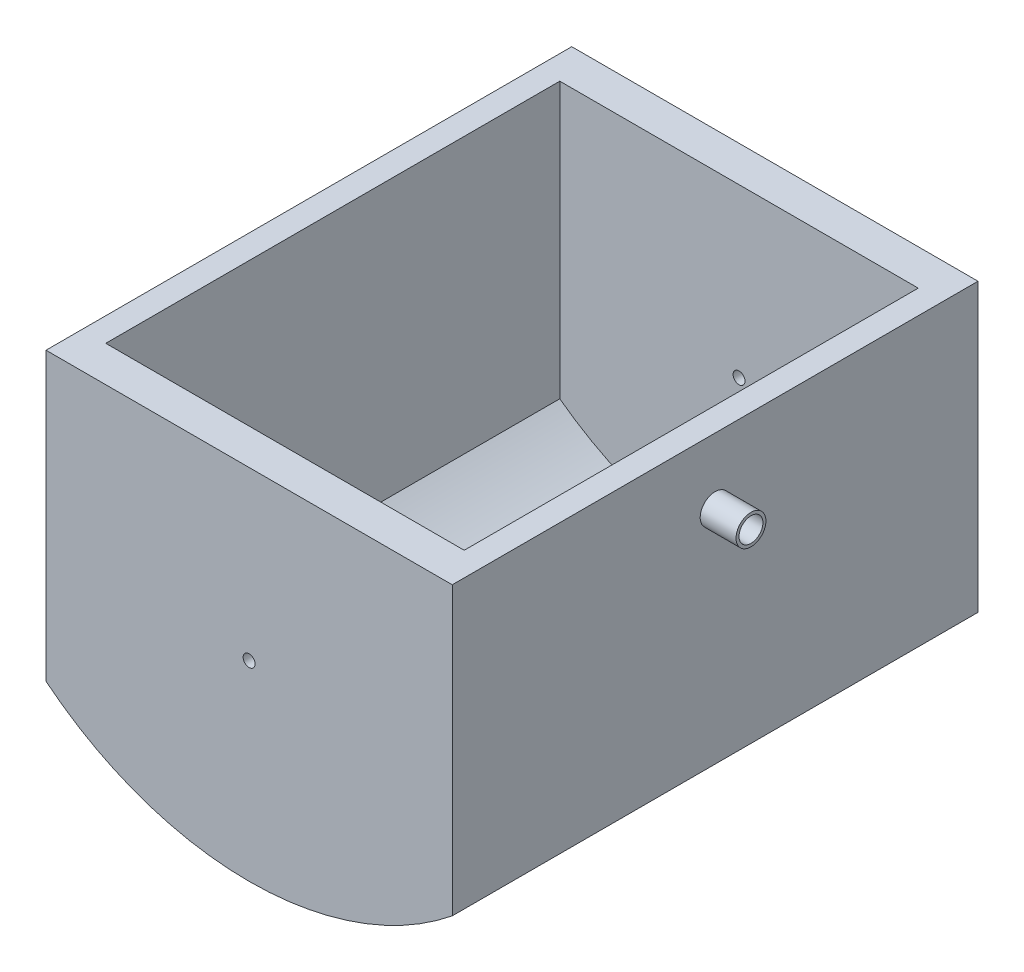
ISO-10303-21;
HEADER;
FILE_DESCRIPTION(('STEP AP214'),'2;1');
FILE_NAME('part.step','',(''),(''),'','','');
FILE_SCHEMA(('AUTOMOTIVE_DESIGN { 1 0 10303 214 1 1 1 1 }'));
ENDSEC;
DATA;
#1=APPLICATION_CONTEXT('core data for automotive mechanical design processes');
#2=APPLICATION_PROTOCOL_DEFINITION('international standard','automotive_design',2000,#1);
#3=PRODUCT_CONTEXT('',#1,'mechanical');
#4=PRODUCT('Part','Part','',(#3));
#5=PRODUCT_RELATED_PRODUCT_CATEGORY('part','',(#4));
#6=PRODUCT_DEFINITION_FORMATION('','',#4);
#7=PRODUCT_DEFINITION_CONTEXT('part definition',#1,'design');
#8=PRODUCT_DEFINITION('design','',#6,#7);
#9=PRODUCT_DEFINITION_SHAPE('','',#8);
#10=(LENGTH_UNIT() NAMED_UNIT(*) SI_UNIT(.MILLI.,.METRE.));
#11=(NAMED_UNIT(*) PLANE_ANGLE_UNIT() SI_UNIT($,.RADIAN.));
#12=(NAMED_UNIT(*) SI_UNIT($,.STERADIAN.) SOLID_ANGLE_UNIT());
#13=UNCERTAINTY_MEASURE_WITH_UNIT(LENGTH_MEASURE(1.E-05),#10,'distance_accuracy_value','');
#14=(GEOMETRIC_REPRESENTATION_CONTEXT(3) GLOBAL_UNCERTAINTY_ASSIGNED_CONTEXT((#13)) GLOBAL_UNIT_ASSIGNED_CONTEXT((#10,
#11,#12)) REPRESENTATION_CONTEXT('',''));
#15=CARTESIAN_POINT('',(0.,0.,0.));
#16=DIRECTION('',(0.,0.,1.));
#17=DIRECTION('',(1.,0.,0.));
#18=AXIS2_PLACEMENT_3D('',#15,#16,#17);
#19=CARTESIAN_POINT('',(170.,140.,220.));
#20=DIRECTION('',(-1.,0.,0.));
#21=DIRECTION('',(0.,-1.,0.));
#22=AXIS2_PLACEMENT_3D('',#19,#20,#21);
#23=PLANE('',#22);
#24=DIRECTION('',(0.,1.,0.));
#25=VECTOR('',#24,1.);
#26=CARTESIAN_POINT('',(170.,140.,-220.));
#27=LINE('',#26,#25);
#28=CARTESIAN_POINT('',(170.,-100.,-220.));
#29=VERTEX_POINT('',#28);
#30=CARTESIAN_POINT('',(170.,140.,-220.));
#31=VERTEX_POINT('',#30);
#32=EDGE_CURVE('E257',#29,#31,#27,.T.);
#33=ORIENTED_EDGE('',*,*,#32,.T.);
#34=DIRECTION('',(0.,0.,-1.));
#35=VECTOR('',#34,1.);
#36=CARTESIAN_POINT('',(170.,140.,220.));
#37=LINE('',#36,#35);
#38=CARTESIAN_POINT('',(170.,140.,220.));
#39=VERTEX_POINT('',#38);
#40=EDGE_CURVE('E265',#39,#31,#37,.T.);
#41=ORIENTED_EDGE('',*,*,#40,.F.);
#42=DIRECTION('',(0.,1.,0.));
#43=VECTOR('',#42,1.);
#44=CARTESIAN_POINT('',(170.,140.,220.));
#45=LINE('',#44,#43);
#46=CARTESIAN_POINT('',(170.,-100.,220.));
#47=VERTEX_POINT('',#46);
#48=EDGE_CURVE('E244',#47,#39,#45,.T.);
#49=ORIENTED_EDGE('',*,*,#48,.F.);
#50=DIRECTION('',(0.,0.,-1.));
#51=VECTOR('',#50,1.);
#52=CARTESIAN_POINT('',(170.,-100.,220.));
#53=LINE('',#52,#51);
#54=EDGE_CURVE('E269',#47,#29,#53,.T.);
#55=ORIENTED_EDGE('',*,*,#54,.T.);
#56=EDGE_LOOP('',(#33,#41,#49,#55));
#57=FACE_BOUND('',#56,.T.);
#58=CARTESIAN_POINT('',(170.,85.,0.));
#59=DIRECTION('',(-1.,0.,0.));
#60=DIRECTION('',(0.,-1.,0.));
#61=AXIS2_PLACEMENT_3D('',#58,#59,#60);
#62=CIRCLE('',#61,12.5);
#63=CARTESIAN_POINT('',(170.,72.5000000000001,0.));
#64=VERTEX_POINT('',#63);
#65=EDGE_CURVE('E11',#64,#64,#62,.F.);
#66=ORIENTED_EDGE('',*,*,#65,.F.);
#67=EDGE_LOOP('',(#66));
#68=FACE_BOUND('',#67,.T.);
#69=ADVANCED_FACE('F45',(#57,#68),#23,.F.);
#70=CARTESIAN_POINT('',(0.,110.833333333333,220.));
#71=DIRECTION('',(0.,0.,-1.));
#72=DIRECTION('',(-1.,0.,0.));
#73=AXIS2_PLACEMENT_3D('',#70,#71,#72);
#74=CYLINDRICAL_SURFACE('',#73,270.833333333333);
#75=CARTESIAN_POINT('',(0.,110.833333333333,-220.));
#76=DIRECTION('',(0.,0.,1.));
#77=DIRECTION('',(1.,0.,0.));
#78=AXIS2_PLACEMENT_3D('',#75,#76,#77);
#79=CIRCLE('',#78,270.833333333333);
#80=CARTESIAN_POINT('',(-170.,-100.,-220.));
#81=VERTEX_POINT('',#80);
#82=EDGE_CURVE('E254',#81,#29,#79,.T.);
#83=ORIENTED_EDGE('',*,*,#82,.T.);
#84=ORIENTED_EDGE('',*,*,#54,.F.);
#85=CARTESIAN_POINT('',(0.,110.833333333333,220.));
#86=DIRECTION('',(0.,0.,1.));
#87=DIRECTION('',(1.,0.,0.));
#88=AXIS2_PLACEMENT_3D('',#85,#86,#87);
#89=CIRCLE('',#88,270.833333333333);
#90=CARTESIAN_POINT('',(-170.,-100.,220.));
#91=VERTEX_POINT('',#90);
#92=EDGE_CURVE('E240',#91,#47,#89,.T.);
#93=ORIENTED_EDGE('',*,*,#92,.F.);
#94=DIRECTION('',(0.,0.,-1.));
#95=VECTOR('',#94,1.);
#96=CARTESIAN_POINT('',(-170.,-100.,220.));
#97=LINE('',#96,#95);
#98=EDGE_CURVE('E273',#91,#81,#97,.T.);
#99=ORIENTED_EDGE('',*,*,#98,.T.);
#100=EDGE_LOOP('',(#83,#84,#93,#99));
#101=FACE_BOUND('',#100,.T.);
#102=CARTESIAN_POINT('',(0.,110.833333333333,-190.));
#103=DIRECTION('',(0.,0.,1.));
#104=DIRECTION('',(1.,0.,0.));
#105=AXIS2_PLACEMENT_3D('',#102,#103,#104);
#106=CIRCLE('',#105,270.833333333333);
#107=CARTESIAN_POINT('',(-80.,-147.91498925919,-190.));
#108=VERTEX_POINT('',#107);
#109=CARTESIAN_POINT('',(80.,-147.91498925919,-190.));
#110=VERTEX_POINT('',#109);
#111=EDGE_CURVE('E224',#108,#110,#106,.T.);
#112=ORIENTED_EDGE('',*,*,#111,.F.);
#113=DIRECTION('',(0.,0.,-1.));
#114=VECTOR('',#113,1.);
#115=CARTESIAN_POINT('',(-80.,-147.91498925919,220.));
#116=LINE('',#115,#114);
#117=CARTESIAN_POINT('',(-80.,-147.91498925919,190.));
#118=VERTEX_POINT('',#117);
#119=EDGE_CURVE('E277',#108,#118,#116,.F.);
#120=ORIENTED_EDGE('',*,*,#119,.T.);
#121=CARTESIAN_POINT('',(0.,110.833333333333,190.));
#122=DIRECTION('',(0.,0.,1.));
#123=DIRECTION('',(1.,0.,0.));
#124=AXIS2_PLACEMENT_3D('',#121,#122,#123);
#125=CIRCLE('',#124,270.833333333333);
#126=CARTESIAN_POINT('',(80.,-147.91498925919,190.));
#127=VERTEX_POINT('',#126);
#128=EDGE_CURVE('E219',#118,#127,#125,.T.);
#129=ORIENTED_EDGE('',*,*,#128,.T.);
#130=DIRECTION('',(0.,0.,-1.));
#131=VECTOR('',#130,1.);
#132=CARTESIAN_POINT('',(80.,-147.91498925919,220.));
#133=LINE('',#132,#131);
#134=EDGE_CURVE('E54',#127,#110,#133,.T.);
#135=ORIENTED_EDGE('',*,*,#134,.T.);
#136=EDGE_LOOP('',(#112,#120,#129,#135));
#137=FACE_BOUND('',#136,.T.);
#138=ADVANCED_FACE('F317',(#101,#137),#74,.T.);
#139=CARTESIAN_POINT('',(-170.,140.,220.));
#140=DIRECTION('',(0.,-1.,0.));
#141=DIRECTION('',(0.,0.,-1.));
#142=AXIS2_PLACEMENT_3D('',#139,#140,#141);
#143=PLANE('',#142);
#144=DIRECTION('',(-1.,0.,0.));
#145=VECTOR('',#144,1.);
#146=CARTESIAN_POINT('',(-170.,140.,-220.));
#147=LINE('',#146,#145);
#148=CARTESIAN_POINT('',(-170.,140.,-220.));
#149=VERTEX_POINT('',#148);
#150=EDGE_CURVE('E241',#31,#149,#147,.T.);
#151=ORIENTED_EDGE('',*,*,#150,.T.);
#152=DIRECTION('',(0.,0.,-1.));
#153=VECTOR('',#152,1.);
#154=CARTESIAN_POINT('',(-170.,140.,220.));
#155=LINE('',#154,#153);
#156=CARTESIAN_POINT('',(-170.,140.,220.));
#157=VERTEX_POINT('',#156);
#158=EDGE_CURVE('E250',#157,#149,#155,.T.);
#159=ORIENTED_EDGE('',*,*,#158,.F.);
#160=DIRECTION('',(-1.,0.,0.));
#161=VECTOR('',#160,1.);
#162=CARTESIAN_POINT('',(-170.,140.,220.));
#163=LINE('',#162,#161);
#164=EDGE_CURVE('E247',#39,#157,#163,.T.);
#165=ORIENTED_EDGE('',*,*,#164,.F.);
#166=ORIENTED_EDGE('',*,*,#40,.T.);
#167=EDGE_LOOP('',(#151,#159,#165,#166));
#168=FACE_BOUND('',#167,.T.);
#169=DIRECTION('',(-1.,0.,0.));
#170=VECTOR('',#169,1.);
#171=CARTESIAN_POINT('',(-150.,140.,-190.));
#172=LINE('',#171,#170);
#173=CARTESIAN_POINT('',(150.,140.,-190.));
#174=VERTEX_POINT('',#173);
#175=CARTESIAN_POINT('',(-150.,140.,-190.));
#176=VERTEX_POINT('',#175);
#177=EDGE_CURVE('E144',#174,#176,#172,.T.);
#178=ORIENTED_EDGE('',*,*,#177,.F.);
#179=DIRECTION('',(0.,0.,1.));
#180=VECTOR('',#179,1.);
#181=CARTESIAN_POINT('',(150.,140.,-190.));
#182=LINE('',#181,#180);
#183=CARTESIAN_POINT('',(150.,140.,190.));
#184=VERTEX_POINT('',#183);
#185=EDGE_CURVE('E206',#174,#184,#182,.T.);
#186=ORIENTED_EDGE('',*,*,#185,.T.);
#187=DIRECTION('',(-1.,0.,0.));
#188=VECTOR('',#187,1.);
#189=CARTESIAN_POINT('',(-150.,140.,190.));
#190=LINE('',#189,#188);
#191=CARTESIAN_POINT('',(-150.,140.,190.));
#192=VERTEX_POINT('',#191);
#193=EDGE_CURVE('E160',#184,#192,#190,.T.);
#194=ORIENTED_EDGE('',*,*,#193,.T.);
#195=DIRECTION('',(0.,0.,1.));
#196=VECTOR('',#195,1.);
#197=CARTESIAN_POINT('',(-150.,140.,-190.));
#198=LINE('',#197,#196);
#199=EDGE_CURVE('E202',#176,#192,#198,.T.);
#200=ORIENTED_EDGE('',*,*,#199,.F.);
#201=EDGE_LOOP('',(#178,#186,#194,#200));
#202=FACE_BOUND('',#201,.T.);
#203=ADVANCED_FACE('F324',(#168,#202),#143,.F.);
#204=CARTESIAN_POINT('',(0.,0.,220.));
#205=DIRECTION('',(0.,0.,-1.));
#206=DIRECTION('',(-1.,0.,0.));
#207=AXIS2_PLACEMENT_3D('',#204,#205,#206);
#208=CYLINDRICAL_SURFACE('',#207,5.);
#209=CARTESIAN_POINT('',(0.,0.,-220.));
#210=DIRECTION('',(0.,0.,1.));
#211=DIRECTION('',(1.,0.,0.));
#212=AXIS2_PLACEMENT_3D('',#209,#210,#211);
#213=CIRCLE('',#212,5.);
#214=CARTESIAN_POINT('',(5.,0.,-220.));
#215=VERTEX_POINT('',#214);
#216=EDGE_CURVE('E227',#215,#215,#213,.T.);
#217=ORIENTED_EDGE('',*,*,#216,.F.);
#218=EDGE_LOOP('',(#217));
#219=FACE_BOUND('',#218,.T.);
#220=CARTESIAN_POINT('',(0.,0.,-190.));
#221=DIRECTION('',(0.,0.,1.));
#222=DIRECTION('',(1.,0.,0.));
#223=AXIS2_PLACEMENT_3D('',#220,#221,#222);
#224=CIRCLE('',#223,5.);
#225=CARTESIAN_POINT('',(5.,0.,-190.));
#226=VERTEX_POINT('',#225);
#227=EDGE_CURVE('E223',#226,#226,#224,.T.);
#228=ORIENTED_EDGE('',*,*,#227,.T.);
#229=EDGE_LOOP('',(#228));
#230=FACE_BOUND('',#229,.T.);
#231=ADVANCED_FACE('F330',(#219,#230),#208,.F.);
#232=CARTESIAN_POINT('',(0.,110.833333333333,220.));
#233=DIRECTION('',(0.,0.,1.));
#234=DIRECTION('',(1.,0.,0.));
#235=AXIS2_PLACEMENT_3D('',#232,#233,#234);
#236=PLANE('',#235);
#237=DIRECTION('',(0.,-1.,0.));
#238=VECTOR('',#237,1.);
#239=CARTESIAN_POINT('',(-170.,140.,220.));
#240=LINE('',#239,#238);
#241=EDGE_CURVE('E236',#157,#91,#240,.T.);
#242=ORIENTED_EDGE('',*,*,#241,.T.);
#243=ORIENTED_EDGE('',*,*,#92,.T.);
#244=ORIENTED_EDGE('',*,*,#48,.T.);
#245=ORIENTED_EDGE('',*,*,#164,.T.);
#246=EDGE_LOOP('',(#242,#243,#244,#245));
#247=FACE_BOUND('',#246,.T.);
#248=CARTESIAN_POINT('',(0.,0.,220.));
#249=DIRECTION('',(0.,0.,1.));
#250=DIRECTION('',(1.,0.,0.));
#251=AXIS2_PLACEMENT_3D('',#248,#249,#250);
#252=CIRCLE('',#251,5.);
#253=CARTESIAN_POINT('',(5.,0.,220.));
#254=VERTEX_POINT('',#253);
#255=EDGE_CURVE('E228',#254,#254,#252,.T.);
#256=ORIENTED_EDGE('',*,*,#255,.F.);
#257=EDGE_LOOP('',(#256));
#258=FACE_BOUND('',#257,.T.);
#259=ADVANCED_FACE('F335',(#247,#258),#236,.T.);
#260=CARTESIAN_POINT('',(0.,110.833333333333,-220.));
#261=DIRECTION('',(0.,0.,1.));
#262=DIRECTION('',(1.,0.,0.));
#263=AXIS2_PLACEMENT_3D('',#260,#261,#262);
#264=PLANE('',#263);
#265=DIRECTION('',(0.,-1.,0.));
#266=VECTOR('',#265,1.);
#267=CARTESIAN_POINT('',(-170.,140.,-220.));
#268=LINE('',#267,#266);
#269=EDGE_CURVE('E232',#149,#81,#268,.T.);
#270=ORIENTED_EDGE('',*,*,#269,.F.);
#271=ORIENTED_EDGE('',*,*,#150,.F.);
#272=ORIENTED_EDGE('',*,*,#32,.F.);
#273=ORIENTED_EDGE('',*,*,#82,.F.);
#274=EDGE_LOOP('',(#270,#271,#272,#273));
#275=FACE_BOUND('',#274,.T.);
#276=ORIENTED_EDGE('',*,*,#216,.T.);
#277=EDGE_LOOP('',(#276));
#278=FACE_BOUND('',#277,.T.);
#279=ADVANCED_FACE('F332',(#275,#278),#264,.F.);
#280=CARTESIAN_POINT('',(-170.,140.,220.));
#281=DIRECTION('',(1.,0.,0.));
#282=DIRECTION('',(0.,1.,0.));
#283=AXIS2_PLACEMENT_3D('',#280,#281,#282);
#284=PLANE('',#283);
#285=ORIENTED_EDGE('',*,*,#269,.T.);
#286=ORIENTED_EDGE('',*,*,#98,.F.);
#287=ORIENTED_EDGE('',*,*,#241,.F.);
#288=ORIENTED_EDGE('',*,*,#158,.T.);
#289=EDGE_LOOP('',(#285,#286,#287,#288));
#290=FACE_BOUND('',#289,.T.);
#291=ADVANCED_FACE('F47',(#290),#284,.F.);
#292=CARTESIAN_POINT('',(0.,0.,190.));
#293=DIRECTION('',(0.,0.,1.));
#294=DIRECTION('',(1.,0.,0.));
#295=AXIS2_PLACEMENT_3D('',#292,#293,#294);
#296=CIRCLE('',#295,5.);
#297=CARTESIAN_POINT('',(5.,0.,190.));
#298=VERTEX_POINT('',#297);
#299=EDGE_CURVE('E205',#298,#298,#296,.T.);
#300=ORIENTED_EDGE('',*,*,#299,.F.);
#301=EDGE_LOOP('',(#300));
#302=FACE_BOUND('',#301,.T.);
#303=ORIENTED_EDGE('',*,*,#255,.T.);
#304=EDGE_LOOP('',(#303));
#305=FACE_BOUND('',#304,.T.);
#306=ADVANCED_FACE('F340',(#302,#305),#208,.F.);
#307=CARTESIAN_POINT('',(80.,-126.900469713501,-190.));
#308=DIRECTION('',(1.,0.,0.));
#309=DIRECTION('',(0.,1.,0.));
#310=AXIS2_PLACEMENT_3D('',#307,#308,#309);
#311=PLANE('',#310);
#312=DIRECTION('',(0.,1.,0.));
#313=VECTOR('',#312,1.);
#314=CARTESIAN_POINT('',(80.,-126.900469713501,190.));
#315=LINE('',#314,#313);
#316=CARTESIAN_POINT('',(79.9999999999999,-126.900469713501,190.));
#317=VERTEX_POINT('',#316);
#318=EDGE_CURVE('E61',#127,#317,#315,.T.);
#319=ORIENTED_EDGE('',*,*,#318,.T.);
#320=DIRECTION('',(0.,0.,1.));
#321=VECTOR('',#320,1.);
#322=CARTESIAN_POINT('',(79.9999999999999,-126.900469713501,-190.));
#323=LINE('',#322,#321);
#324=CARTESIAN_POINT('',(79.9999999999999,-126.900469713501,-190.));
#325=VERTEX_POINT('',#324);
#326=EDGE_CURVE('E213',#325,#317,#323,.T.);
#327=ORIENTED_EDGE('',*,*,#326,.F.);
#328=DIRECTION('',(0.,1.,0.));
#329=VECTOR('',#328,1.);
#330=CARTESIAN_POINT('',(80.,-126.900469713501,-190.));
#331=LINE('',#330,#329);
#332=EDGE_CURVE('E172',#110,#325,#331,.T.);
#333=ORIENTED_EDGE('',*,*,#332,.F.);
#334=ORIENTED_EDGE('',*,*,#134,.F.);
#335=EDGE_LOOP('',(#319,#327,#333,#334));
#336=FACE_BOUND('',#335,.T.);
#337=ADVANCED_FACE('F343',(#336),#311,.F.);
#338=CARTESIAN_POINT('',(-80.,-126.900469713501,-190.));
#339=DIRECTION('',(-1.,0.,0.));
#340=DIRECTION('',(0.,-1.,0.));
#341=AXIS2_PLACEMENT_3D('',#338,#339,#340);
#342=PLANE('',#341);
#343=DIRECTION('',(0.,-1.,0.));
#344=VECTOR('',#343,1.);
#345=CARTESIAN_POINT('',(-80.,-126.900469713501,-190.));
#346=LINE('',#345,#344);
#347=CARTESIAN_POINT('',(-80.,-126.900469713501,-190.));
#348=VERTEX_POINT('',#347);
#349=EDGE_CURVE('E153',#348,#108,#346,.T.);
#350=ORIENTED_EDGE('',*,*,#349,.F.);
#351=DIRECTION('',(0.,0.,1.));
#352=VECTOR('',#351,1.);
#353=CARTESIAN_POINT('',(-80.,-126.900469713501,-190.));
#354=LINE('',#353,#352);
#355=CARTESIAN_POINT('',(-80.,-126.900469713501,190.));
#356=VERTEX_POINT('',#355);
#357=EDGE_CURVE('E143',#348,#356,#354,.T.);
#358=ORIENTED_EDGE('',*,*,#357,.T.);
#359=DIRECTION('',(0.,-1.,0.));
#360=VECTOR('',#359,1.);
#361=CARTESIAN_POINT('',(-80.,-126.900469713501,190.));
#362=LINE('',#361,#360);
#363=EDGE_CURVE('E190',#356,#118,#362,.T.);
#364=ORIENTED_EDGE('',*,*,#363,.T.);
#365=ORIENTED_EDGE('',*,*,#119,.F.);
#366=EDGE_LOOP('',(#350,#358,#364,#365));
#367=FACE_BOUND('',#366,.T.);
#368=ADVANCED_FACE('F352',(#367),#342,.F.);
#369=CARTESIAN_POINT('',(0.,110.833333333333,-190.));
#370=DIRECTION('',(0.,0.,1.));
#371=DIRECTION('',(1.,0.,0.));
#372=AXIS2_PLACEMENT_3D('',#369,#370,#371);
#373=PLANE('',#372);
#374=ORIENTED_EDGE('',*,*,#227,.F.);
#375=EDGE_LOOP('',(#374));
#376=FACE_BOUND('',#375,.T.);
#377=ORIENTED_EDGE('',*,*,#111,.T.);
#378=ORIENTED_EDGE('',*,*,#332,.T.);
#379=CARTESIAN_POINT('',(0.,110.833333333333,-190.));
#380=DIRECTION('',(0.,0.,1.));
#381=DIRECTION('',(1.,0.,0.));
#382=AXIS2_PLACEMENT_3D('',#379,#380,#381);
#383=CIRCLE('',#382,250.833333333333);
#384=CARTESIAN_POINT('',(150.,-90.2073618283953,-190.));
#385=VERTEX_POINT('',#384);
#386=EDGE_CURVE('E175',#325,#385,#383,.T.);
#387=ORIENTED_EDGE('',*,*,#386,.T.);
#388=DIRECTION('',(0.,1.,0.));
#389=VECTOR('',#388,1.);
#390=CARTESIAN_POINT('',(150.,140.,-190.));
#391=LINE('',#390,#389);
#392=EDGE_CURVE('E179',#385,#174,#391,.T.);
#393=ORIENTED_EDGE('',*,*,#392,.T.);
#394=ORIENTED_EDGE('',*,*,#177,.T.);
#395=DIRECTION('',(0.,-1.,0.));
#396=VECTOR('',#395,1.);
#397=CARTESIAN_POINT('',(-150.,140.,-190.));
#398=LINE('',#397,#396);
#399=CARTESIAN_POINT('',(-150.,-90.2073618283952,-190.));
#400=VERTEX_POINT('',#399);
#401=EDGE_CURVE('E138',#176,#400,#398,.T.);
#402=ORIENTED_EDGE('',*,*,#401,.T.);
#403=CARTESIAN_POINT('',(0.,110.833333333333,-190.));
#404=DIRECTION('',(0.,0.,1.));
#405=DIRECTION('',(1.,0.,0.));
#406=AXIS2_PLACEMENT_3D('',#403,#404,#405);
#407=CIRCLE('',#406,250.833333333333);
#408=EDGE_CURVE('E147',#400,#348,#407,.T.);
#409=ORIENTED_EDGE('',*,*,#408,.T.);
#410=ORIENTED_EDGE('',*,*,#349,.T.);
#411=EDGE_LOOP('',(#377,#378,#387,#393,#394,#402,#409,#410));
#412=FACE_BOUND('',#411,.T.);
#413=ADVANCED_FACE('F155',(#376,#412),#373,.T.);
#414=CARTESIAN_POINT('',(0.,110.833333333333,190.));
#415=DIRECTION('',(0.,0.,1.));
#416=DIRECTION('',(1.,0.,0.));
#417=AXIS2_PLACEMENT_3D('',#414,#415,#416);
#418=PLANE('',#417);
#419=ORIENTED_EDGE('',*,*,#299,.T.);
#420=EDGE_LOOP('',(#419));
#421=FACE_BOUND('',#420,.T.);
#422=ORIENTED_EDGE('',*,*,#363,.F.);
#423=CARTESIAN_POINT('',(0.,110.833333333333,190.));
#424=DIRECTION('',(0.,0.,1.));
#425=DIRECTION('',(1.,0.,0.));
#426=AXIS2_PLACEMENT_3D('',#423,#424,#425);
#427=CIRCLE('',#426,250.833333333333);
#428=CARTESIAN_POINT('',(-150.,-90.2073618283952,190.));
#429=VERTEX_POINT('',#428);
#430=EDGE_CURVE('E186',#429,#356,#427,.T.);
#431=ORIENTED_EDGE('',*,*,#430,.F.);
#432=DIRECTION('',(0.,-1.,0.));
#433=VECTOR('',#432,1.);
#434=CARTESIAN_POINT('',(-150.,140.,190.));
#435=LINE('',#434,#433);
#436=EDGE_CURVE('E68',#192,#429,#435,.T.);
#437=ORIENTED_EDGE('',*,*,#436,.F.);
#438=ORIENTED_EDGE('',*,*,#193,.F.);
#439=DIRECTION('',(0.,1.,0.));
#440=VECTOR('',#439,1.);
#441=CARTESIAN_POINT('',(150.,140.,190.));
#442=LINE('',#441,#440);
#443=CARTESIAN_POINT('',(150.,-90.2073618283953,190.));
#444=VERTEX_POINT('',#443);
#445=EDGE_CURVE('E164',#444,#184,#442,.T.);
#446=ORIENTED_EDGE('',*,*,#445,.F.);
#447=CARTESIAN_POINT('',(0.,110.833333333333,190.));
#448=DIRECTION('',(0.,0.,1.));
#449=DIRECTION('',(1.,0.,0.));
#450=AXIS2_PLACEMENT_3D('',#447,#448,#449);
#451=CIRCLE('',#450,250.833333333333);
#452=EDGE_CURVE('E196',#317,#444,#451,.T.);
#453=ORIENTED_EDGE('',*,*,#452,.F.);
#454=ORIENTED_EDGE('',*,*,#318,.F.);
#455=ORIENTED_EDGE('',*,*,#128,.F.);
#456=EDGE_LOOP('',(#422,#431,#437,#438,#446,#453,#454,#455));
#457=FACE_BOUND('',#456,.T.);
#458=ADVANCED_FACE('F348',(#421,#457),#418,.F.);
#459=CARTESIAN_POINT('',(-150.,140.,-190.));
#460=DIRECTION('',(-1.,0.,0.));
#461=DIRECTION('',(0.,-1.,0.));
#462=AXIS2_PLACEMENT_3D('',#459,#460,#461);
#463=PLANE('',#462);
#464=ORIENTED_EDGE('',*,*,#436,.T.);
#465=DIRECTION('',(0.,0.,1.));
#466=VECTOR('',#465,1.);
#467=CARTESIAN_POINT('',(-150.,-90.2073618283952,-190.));
#468=LINE('',#467,#466);
#469=EDGE_CURVE('E134',#400,#429,#468,.T.);
#470=ORIENTED_EDGE('',*,*,#469,.F.);
#471=ORIENTED_EDGE('',*,*,#401,.F.);
#472=ORIENTED_EDGE('',*,*,#199,.T.);
#473=EDGE_LOOP('',(#464,#470,#471,#472));
#474=FACE_BOUND('',#473,.T.);
#475=ADVANCED_FACE('F136',(#474),#463,.F.);
#476=CARTESIAN_POINT('',(150.,140.,-190.));
#477=DIRECTION('',(1.,0.,0.));
#478=DIRECTION('',(0.,1.,0.));
#479=AXIS2_PLACEMENT_3D('',#476,#477,#478);
#480=PLANE('',#479);
#481=CARTESIAN_POINT('',(150.,85.,0.));
#482=DIRECTION('',(1.,0.,0.));
#483=DIRECTION('',(0.,1.,0.));
#484=AXIS2_PLACEMENT_3D('',#481,#482,#483);
#485=CIRCLE('',#484,10.);
#486=CARTESIAN_POINT('',(150.,95.,0.));
#487=VERTEX_POINT('',#486);
#488=EDGE_CURVE('E187',#487,#487,#485,.T.);
#489=ORIENTED_EDGE('',*,*,#488,.T.);
#490=EDGE_LOOP('',(#489));
#491=FACE_BOUND('',#490,.T.);
#492=ORIENTED_EDGE('',*,*,#445,.T.);
#493=ORIENTED_EDGE('',*,*,#185,.F.);
#494=ORIENTED_EDGE('',*,*,#392,.F.);
#495=DIRECTION('',(0.,0.,1.));
#496=VECTOR('',#495,1.);
#497=CARTESIAN_POINT('',(150.,-90.2073618283953,-190.));
#498=LINE('',#497,#496);
#499=EDGE_CURVE('E210',#385,#444,#498,.T.);
#500=ORIENTED_EDGE('',*,*,#499,.T.);
#501=EDGE_LOOP('',(#492,#493,#494,#500));
#502=FACE_BOUND('',#501,.T.);
#503=ADVANCED_FACE('F347',(#491,#502),#480,.F.);
#504=CARTESIAN_POINT('',(0.,110.833333333333,-190.));
#505=DIRECTION('',(0.,0.,1.));
#506=DIRECTION('',(1.,0.,0.));
#507=AXIS2_PLACEMENT_3D('',#504,#505,#506);
#508=CYLINDRICAL_SURFACE('',#507,250.833333333333);
#509=ORIENTED_EDGE('',*,*,#452,.T.);
#510=ORIENTED_EDGE('',*,*,#499,.F.);
#511=ORIENTED_EDGE('',*,*,#386,.F.);
#512=ORIENTED_EDGE('',*,*,#326,.T.);
#513=EDGE_LOOP('',(#509,#510,#511,#512));
#514=FACE_BOUND('',#513,.T.);
#515=ADVANCED_FACE('F351',(#514),#508,.F.);
#516=CARTESIAN_POINT('',(0.,110.833333333333,-190.));
#517=DIRECTION('',(0.,0.,1.));
#518=DIRECTION('',(1.,0.,0.));
#519=AXIS2_PLACEMENT_3D('',#516,#517,#518);
#520=CYLINDRICAL_SURFACE('',#519,250.833333333333);
#521=ORIENTED_EDGE('',*,*,#430,.T.);
#522=ORIENTED_EDGE('',*,*,#357,.F.);
#523=ORIENTED_EDGE('',*,*,#408,.F.);
#524=ORIENTED_EDGE('',*,*,#469,.T.);
#525=EDGE_LOOP('',(#521,#522,#523,#524));
#526=FACE_BOUND('',#525,.T.);
#527=ADVANCED_FACE('F148',(#526),#520,.F.);
#528=CARTESIAN_POINT('',(340.,85.0000000000001,0.));
#529=DIRECTION('',(-1.,0.,0.));
#530=DIRECTION('',(0.,-1.,0.));
#531=AXIS2_PLACEMENT_3D('',#528,#529,#530);
#532=CYLINDRICAL_SURFACE('',#531,10.);
#533=ORIENTED_EDGE('',*,*,#488,.F.);
#534=EDGE_LOOP('',(#533));
#535=FACE_BOUND('',#534,.T.);
#536=CARTESIAN_POINT('',(200.,85.,0.));
#537=DIRECTION('',(1.,0.,0.));
#538=DIRECTION('',(0.,1.,0.));
#539=AXIS2_PLACEMENT_3D('',#536,#537,#538);
#540=CIRCLE('',#539,10.);
#541=CARTESIAN_POINT('',(200.,95.,0.));
#542=VERTEX_POINT('',#541);
#543=EDGE_CURVE('E295',#542,#542,#540,.T.);
#544=ORIENTED_EDGE('',*,*,#543,.T.);
#545=EDGE_LOOP('',(#544));
#546=FACE_BOUND('',#545,.T.);
#547=ADVANCED_FACE('F302',(#535,#546),#532,.F.);
#548=CARTESIAN_POINT('',(200.,85.,0.));
#549=DIRECTION('',(1.,0.,0.));
#550=DIRECTION('',(0.,1.,0.));
#551=AXIS2_PLACEMENT_3D('',#548,#549,#550);
#552=PLANE('',#551);
#553=CARTESIAN_POINT('',(200.,85.,0.));
#554=DIRECTION('',(1.,0.,0.));
#555=DIRECTION('',(0.,1.,0.));
#556=AXIS2_PLACEMENT_3D('',#553,#554,#555);
#557=CIRCLE('',#556,12.5);
#558=CARTESIAN_POINT('',(200.,97.5,0.));
#559=VERTEX_POINT('',#558);
#560=EDGE_CURVE('E167',#559,#559,#557,.T.);
#561=ORIENTED_EDGE('',*,*,#560,.T.);
#562=EDGE_LOOP('',(#561));
#563=FACE_BOUND('',#562,.T.);
#564=ORIENTED_EDGE('',*,*,#543,.F.);
#565=EDGE_LOOP('',(#564));
#566=FACE_BOUND('',#565,.T.);
#567=ADVANCED_FACE('F304',(#563,#566),#552,.T.);
#568=CARTESIAN_POINT('',(200.,85.,0.));
#569=DIRECTION('',(-1.,0.,0.));
#570=DIRECTION('',(0.,-1.,0.));
#571=AXIS2_PLACEMENT_3D('',#568,#569,#570);
#572=CYLINDRICAL_SURFACE('',#571,12.5);
#573=ORIENTED_EDGE('',*,*,#560,.F.);
#574=EDGE_LOOP('',(#573));
#575=FACE_BOUND('',#574,.T.);
#576=ORIENTED_EDGE('',*,*,#65,.T.);
#577=EDGE_LOOP('',(#576));
#578=FACE_BOUND('',#577,.T.);
#579=ADVANCED_FACE('F306',(#575,#578),#572,.T.);
#580=CLOSED_SHELL('',(#69,#138,#203,#231,#259,#279,#291,#306,#337,#368,#413,#458,#475,#503,#515,
#527,#547,#567,#579));
#581=MANIFOLD_SOLID_BREP('B2',#580);
#582=ADVANCED_BREP_SHAPE_REPRESENTATION('',(#18,#581),#14);
#583=SHAPE_DEFINITION_REPRESENTATION(#9,#582);
ENDSEC;
END-ISO-10303-21;
